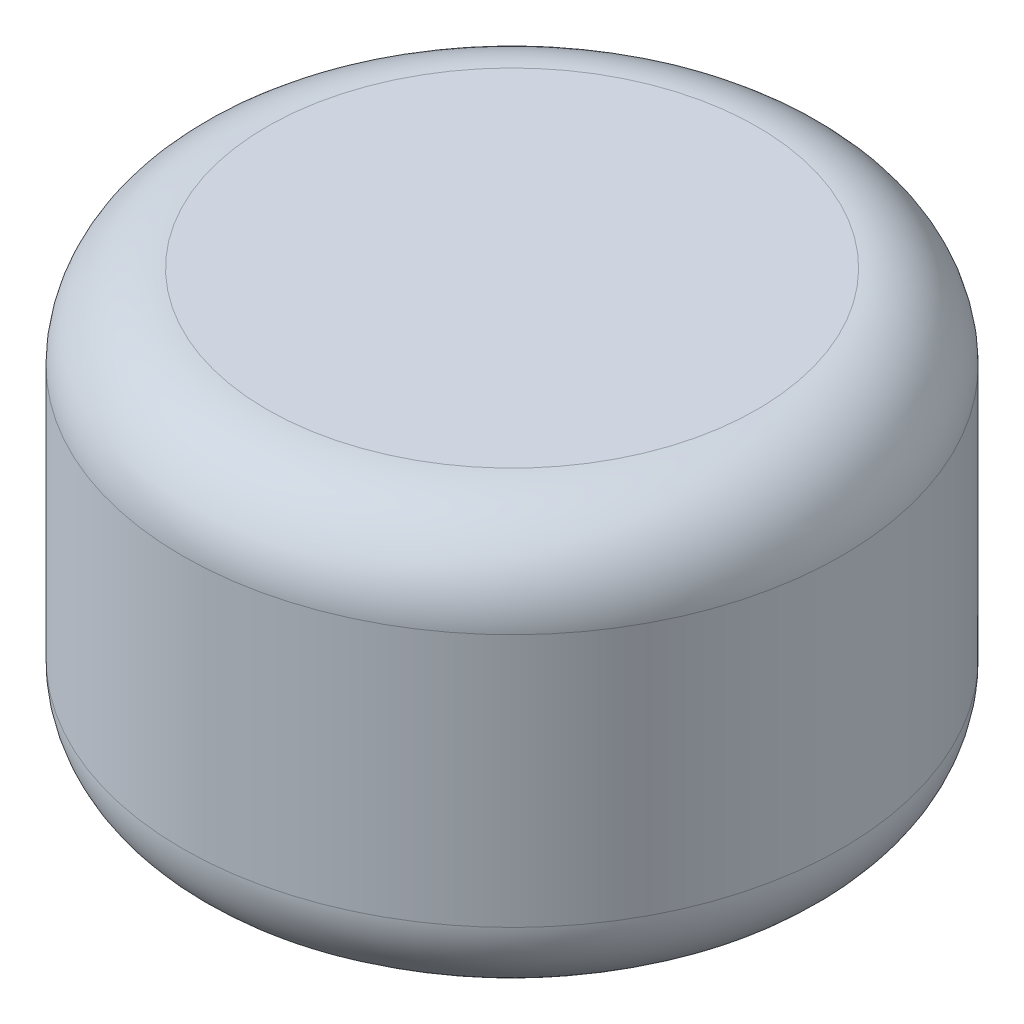
ISO-10303-21;
HEADER;
FILE_DESCRIPTION(('STEP AP214'),'2;1');
FILE_NAME('part.step','',(''),(''),'','','');
FILE_SCHEMA(('AUTOMOTIVE_DESIGN { 1 0 10303 214 1 1 1 1 }'));
ENDSEC;
DATA;
#1=APPLICATION_CONTEXT('core data for automotive mechanical design processes');
#2=APPLICATION_PROTOCOL_DEFINITION('international standard','automotive_design',2000,#1);
#3=PRODUCT_CONTEXT('',#1,'mechanical');
#4=PRODUCT('Part','Part','',(#3));
#5=PRODUCT_RELATED_PRODUCT_CATEGORY('part','',(#4));
#6=PRODUCT_DEFINITION_FORMATION('','',#4);
#7=PRODUCT_DEFINITION_CONTEXT('part definition',#1,'design');
#8=PRODUCT_DEFINITION('design','',#6,#7);
#9=PRODUCT_DEFINITION_SHAPE('','',#8);
#10=(LENGTH_UNIT() NAMED_UNIT(*) SI_UNIT(.MILLI.,.METRE.));
#11=(NAMED_UNIT(*) PLANE_ANGLE_UNIT() SI_UNIT($,.RADIAN.));
#12=(NAMED_UNIT(*) SI_UNIT($,.STERADIAN.) SOLID_ANGLE_UNIT());
#13=UNCERTAINTY_MEASURE_WITH_UNIT(LENGTH_MEASURE(1.E-05),#10,'distance_accuracy_value','');
#14=(GEOMETRIC_REPRESENTATION_CONTEXT(3) GLOBAL_UNCERTAINTY_ASSIGNED_CONTEXT((#13)) GLOBAL_UNIT_ASSIGNED_CONTEXT((#10,
#11,#12)) REPRESENTATION_CONTEXT('',''));
#15=CARTESIAN_POINT('',(0.,0.,0.));
#16=DIRECTION('',(0.,0.,1.));
#17=DIRECTION('',(1.,0.,0.));
#18=AXIS2_PLACEMENT_3D('',#15,#16,#17);
#19=CARTESIAN_POINT('',(0.,63.5,0.));
#20=DIRECTION('',(0.,-1.,0.));
#21=DIRECTION('',(0.,0.,-1.));
#22=AXIS2_PLACEMENT_3D('',#19,#20,#21);
#23=CYLINDRICAL_SURFACE('',#22,49.53);
#24=CARTESIAN_POINT('',(0.,12.7,0.));
#25=DIRECTION('',(0.,1.,0.));
#26=DIRECTION('',(0.,0.,1.));
#27=AXIS2_PLACEMENT_3D('',#24,#25,#26);
#28=CIRCLE('',#27,49.53);
#29=CARTESIAN_POINT('',(0.,12.7,49.53));
#30=VERTEX_POINT('',#29);
#31=EDGE_CURVE('E47',#30,#30,#28,.T.);
#32=ORIENTED_EDGE('',*,*,#31,.T.);
#33=EDGE_LOOP('',(#32));
#34=FACE_BOUND('',#33,.T.);
#35=CARTESIAN_POINT('',(0.,50.8,0.));
#36=DIRECTION('',(0.,1.,0.));
#37=DIRECTION('',(0.,0.,1.));
#38=AXIS2_PLACEMENT_3D('',#35,#36,#37);
#39=CIRCLE('',#38,49.53);
#40=CARTESIAN_POINT('',(0.,50.8,49.53));
#41=VERTEX_POINT('',#40);
#42=EDGE_CURVE('E51',#41,#41,#39,.F.);
#43=ORIENTED_EDGE('',*,*,#42,.T.);
#44=EDGE_LOOP('',(#43));
#45=FACE_BOUND('',#44,.T.);
#46=ADVANCED_FACE('F36',(#34,#45),#23,.T.);
#47=CARTESIAN_POINT('',(0.,63.5,0.));
#48=DIRECTION('',(0.,1.,0.));
#49=DIRECTION('',(0.,0.,1.));
#50=AXIS2_PLACEMENT_3D('',#47,#48,#49);
#51=PLANE('',#50);
#52=CARTESIAN_POINT('',(0.,63.5,0.));
#53=DIRECTION('',(0.,1.,0.));
#54=DIRECTION('',(0.,0.,1.));
#55=AXIS2_PLACEMENT_3D('',#52,#53,#54);
#56=CIRCLE('',#55,36.83);
#57=CARTESIAN_POINT('',(0.,63.5,36.83));
#58=VERTEX_POINT('',#57);
#59=EDGE_CURVE('E10',#58,#58,#56,.T.);
#60=ORIENTED_EDGE('',*,*,#59,.T.);
#61=EDGE_LOOP('',(#60));
#62=FACE_BOUND('',#61,.T.);
#63=ADVANCED_FACE('F67',(#62),#51,.T.);
#64=CARTESIAN_POINT('',(0.,0.,0.));
#65=DIRECTION('',(0.,1.,0.));
#66=DIRECTION('',(0.,0.,1.));
#67=AXIS2_PLACEMENT_3D('',#64,#65,#66);
#68=PLANE('',#67);
#69=CARTESIAN_POINT('',(0.,0.,0.));
#70=DIRECTION('',(0.,1.,0.));
#71=DIRECTION('',(0.,0.,1.));
#72=AXIS2_PLACEMENT_3D('',#69,#70,#71);
#73=CIRCLE('',#72,36.83);
#74=CARTESIAN_POINT('',(0.,0.,36.83));
#75=VERTEX_POINT('',#74);
#76=EDGE_CURVE('E43',#75,#75,#73,.F.);
#77=ORIENTED_EDGE('',*,*,#76,.T.);
#78=EDGE_LOOP('',(#77));
#79=FACE_BOUND('',#78,.T.);
#80=ADVANCED_FACE('F64',(#79),#68,.F.);
#81=CARTESIAN_POINT('',(0.,12.7,0.));
#82=DIRECTION('',(0.,1.,0.));
#83=DIRECTION('',(0.,0.,1.));
#84=AXIS2_PLACEMENT_3D('',#81,#82,#83);
#85=TOROIDAL_SURFACE('',#84,36.83,12.7);
#86=ORIENTED_EDGE('',*,*,#76,.F.);
#87=EDGE_LOOP('',(#86));
#88=FACE_BOUND('',#87,.T.);
#89=ORIENTED_EDGE('',*,*,#31,.F.);
#90=EDGE_LOOP('',(#89));
#91=FACE_BOUND('',#90,.T.);
#92=ADVANCED_FACE('F60',(#88,#91),#85,.T.);
#93=CARTESIAN_POINT('',(0.,50.8,0.));
#94=DIRECTION('',(0.,1.,0.));
#95=DIRECTION('',(0.,0.,1.));
#96=AXIS2_PLACEMENT_3D('',#93,#94,#95);
#97=TOROIDAL_SURFACE('',#96,36.83,12.7);
#98=ORIENTED_EDGE('',*,*,#42,.F.);
#99=EDGE_LOOP('',(#98));
#100=FACE_BOUND('',#99,.T.);
#101=ORIENTED_EDGE('',*,*,#59,.F.);
#102=EDGE_LOOP('',(#101));
#103=FACE_BOUND('',#102,.T.);
#104=ADVANCED_FACE('F38',(#100,#103),#97,.T.);
#105=CLOSED_SHELL('',(#46,#63,#80,#92,#104));
#106=MANIFOLD_SOLID_BREP('B2',#105);
#107=ADVANCED_BREP_SHAPE_REPRESENTATION('',(#18,#106),#14);
#108=SHAPE_DEFINITION_REPRESENTATION(#9,#107);
ENDSEC;
END-ISO-10303-21;
